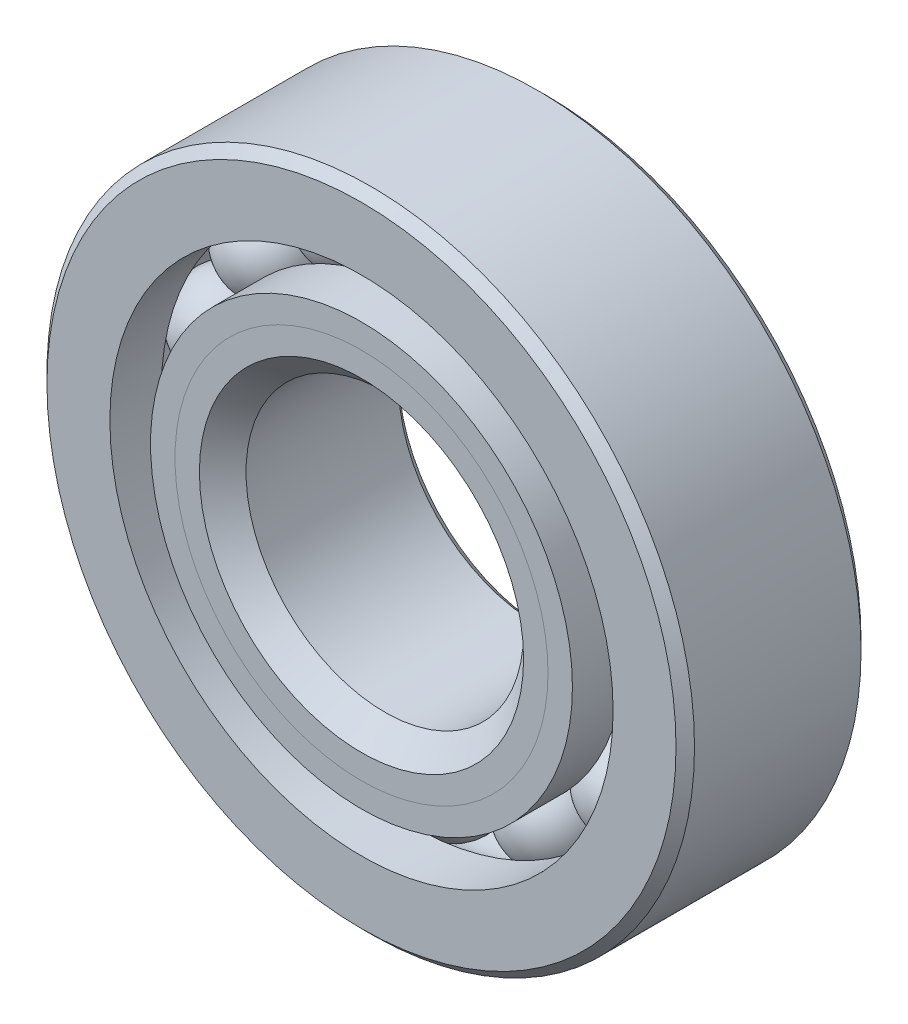
ISO-10303-21;
HEADER;
FILE_DESCRIPTION(('STEP AP214'),'2;1');
FILE_NAME('part.step','',(''),(''),'','','');
FILE_SCHEMA(('AUTOMOTIVE_DESIGN { 1 0 10303 214 1 1 1 1 }'));
ENDSEC;
DATA;
#1=APPLICATION_CONTEXT('core data for automotive mechanical design processes');
#2=APPLICATION_PROTOCOL_DEFINITION('international standard','automotive_design',2000,#1);
#3=PRODUCT_CONTEXT('',#1,'mechanical');
#4=PRODUCT('Part','Part','',(#3));
#5=PRODUCT_RELATED_PRODUCT_CATEGORY('part','',(#4));
#6=PRODUCT_DEFINITION_FORMATION('','',#4);
#7=PRODUCT_DEFINITION_CONTEXT('part definition',#1,'design');
#8=PRODUCT_DEFINITION('design','',#6,#7);
#9=PRODUCT_DEFINITION_SHAPE('','',#8);
#10=(LENGTH_UNIT() NAMED_UNIT(*) SI_UNIT(.MILLI.,.METRE.));
#11=(NAMED_UNIT(*) PLANE_ANGLE_UNIT() SI_UNIT($,.RADIAN.));
#12=(NAMED_UNIT(*) SI_UNIT($,.STERADIAN.) SOLID_ANGLE_UNIT());
#13=UNCERTAINTY_MEASURE_WITH_UNIT(LENGTH_MEASURE(1.E-05),#10,'distance_accuracy_value','');
#14=(GEOMETRIC_REPRESENTATION_CONTEXT(3) GLOBAL_UNCERTAINTY_ASSIGNED_CONTEXT((#13)) GLOBAL_UNIT_ASSIGNED_CONTEXT((#10,
#11,#12)) REPRESENTATION_CONTEXT('',''));
#15=CARTESIAN_POINT('',(0.,0.,0.));
#16=DIRECTION('',(0.,0.,1.));
#17=DIRECTION('',(1.,0.,0.));
#18=AXIS2_PLACEMENT_3D('',#15,#16,#17);
#19=CARTESIAN_POINT('',(-3.44395217924552,7.1514403889755,0.));
#20=DIRECTION('',(0.,0.,1.));
#21=DIRECTION('',(0.433883739117546,-0.900968867902425,0.));
#22=AXIS2_PLACEMENT_3D('',#19,#20,#21);
#23=SPHERICAL_SURFACE('',#22,1.57421805197336);
#24=CARTESIAN_POINT('',(-3.44395217924552,7.1514403889755,1.57421805197336));
#25=VERTEX_POINT('',#24);
#26=VERTEX_LOOP('',#25);
#27=FACE_BOUND('',#26,.T.);
#28=ADVANCED_FACE('F43',(#27),#23,.T.);
#29=CLOSED_SHELL('',(#28));
#30=MANIFOLD_SOLID_BREP('B2',#29);
#31=CARTESIAN_POINT('',(-6.20578739208992,4.94895030225377,0.));
#32=DIRECTION('',(0.,0.,1.));
#33=DIRECTION('',(0.781831482468022,-0.623489801858743,0.));
#34=AXIS2_PLACEMENT_3D('',#31,#32,#33);
#35=SPHERICAL_SURFACE('',#34,1.57421805197336);
#36=CARTESIAN_POINT('',(-6.20578739208992,4.94895030225377,1.57421805197336));
#37=VERTEX_POINT('',#36);
#38=VERTEX_LOOP('',#37);
#39=FACE_BOUND('',#38,.T.);
#40=ADVANCED_FACE('F64',(#39),#35,.T.);
#41=CLOSED_SHELL('',(#40));
#42=MANIFOLD_SOLID_BREP('B6',#41);
#43=CARTESIAN_POINT('',(-7.73849030294321,1.76625991327833,0.));
#44=DIRECTION('',(0.,0.,1.));
#45=DIRECTION('',(0.974927912181821,-0.222520933956325,0.));
#46=AXIS2_PLACEMENT_3D('',#43,#44,#45);
#47=SPHERICAL_SURFACE('',#46,1.57421805197336);
#48=CARTESIAN_POINT('',(-7.73849030294321,1.76625991327833,1.57421805197336));
#49=VERTEX_POINT('',#48);
#50=VERTEX_LOOP('',#49);
#51=FACE_BOUND('',#50,.T.);
#52=ADVANCED_FACE('F85',(#51),#47,.T.);
#53=CLOSED_SHELL('',(#52));
#54=MANIFOLD_SOLID_BREP('B39',#53);
#55=CARTESIAN_POINT('',(-7.73849030294324,-1.76625991327817,0.));
#56=DIRECTION('',(0.,0.,1.));
#57=DIRECTION('',(0.974927912181826,0.222520933956305,0.));
#58=AXIS2_PLACEMENT_3D('',#55,#56,#57);
#59=SPHERICAL_SURFACE('',#58,1.57421805197336);
#60=CARTESIAN_POINT('',(-7.73849030294324,-1.76625991327817,1.57421805197336));
#61=VERTEX_POINT('',#60);
#62=VERTEX_LOOP('',#61);
#63=FACE_BOUND('',#62,.T.);
#64=ADVANCED_FACE('F106',(#63),#59,.T.);
#65=CLOSED_SHELL('',(#64));
#66=MANIFOLD_SOLID_BREP('B60',#65);
#67=CARTESIAN_POINT('',(-6.20578739209003,-4.94895030225364,0.));
#68=DIRECTION('',(0.,0.,1.));
#69=DIRECTION('',(0.781831482468035,0.623489801858727,0.));
#70=AXIS2_PLACEMENT_3D('',#67,#68,#69);
#71=SPHERICAL_SURFACE('',#70,1.57421805197336);
#72=CARTESIAN_POINT('',(-6.20578739209003,-4.94895030225364,1.57421805197336));
#73=VERTEX_POINT('',#72);
#74=VERTEX_LOOP('',#73);
#75=FACE_BOUND('',#74,.T.);
#76=ADVANCED_FACE('F127',(#75),#71,.T.);
#77=CLOSED_SHELL('',(#76));
#78=MANIFOLD_SOLID_BREP('B81',#77);
#79=CARTESIAN_POINT('',(-3.44395217924567,-7.15144038897542,0.));
#80=DIRECTION('',(0.,0.,1.));
#81=DIRECTION('',(0.433883739117565,0.900968867902416,0.));
#82=AXIS2_PLACEMENT_3D('',#79,#80,#81);
#83=SPHERICAL_SURFACE('',#82,1.57421805197336);
#84=CARTESIAN_POINT('',(-3.44395217924567,-7.15144038897542,1.57421805197336));
#85=VERTEX_POINT('',#84);
#86=VERTEX_LOOP('',#85);
#87=FACE_BOUND('',#86,.T.);
#88=ADVANCED_FACE('F148',(#87),#83,.T.);
#89=CLOSED_SHELL('',(#88));
#90=MANIFOLD_SOLID_BREP('B102',#89);
#91=CARTESIAN_POINT('',(0.,-7.9375,0.));
#92=DIRECTION('',(0.,0.,1.));
#93=DIRECTION('',(0.,1.,0.));
#94=AXIS2_PLACEMENT_3D('',#91,#92,#93);
#95=SPHERICAL_SURFACE('',#94,1.57421805197336);
#96=CARTESIAN_POINT('',(0.,-7.9375,1.57421805197336));
#97=VERTEX_POINT('',#96);
#98=VERTEX_LOOP('',#97);
#99=FACE_BOUND('',#98,.T.);
#100=ADVANCED_FACE('F169',(#99),#95,.T.);
#101=CLOSED_SHELL('',(#100));
#102=MANIFOLD_SOLID_BREP('B123',#101);
#103=CARTESIAN_POINT('',(3.44395217924557,-7.15144038897547,0.));
#104=DIRECTION('',(0.,0.,1.));
#105=DIRECTION('',(-0.433883739117553,0.900968867902422,0.));
#106=AXIS2_PLACEMENT_3D('',#103,#104,#105);
#107=SPHERICAL_SURFACE('',#106,1.57421805197336);
#108=CARTESIAN_POINT('',(3.44395217924557,-7.15144038897547,1.57421805197336));
#109=VERTEX_POINT('',#108);
#110=VERTEX_LOOP('',#109);
#111=FACE_BOUND('',#110,.T.);
#112=ADVANCED_FACE('F190',(#111),#107,.T.);
#113=CLOSED_SHELL('',(#112));
#114=MANIFOLD_SOLID_BREP('B144',#113);
#115=CARTESIAN_POINT('',(6.20578739208996,-4.94895030225373,0.));
#116=DIRECTION('',(0.,0.,1.));
#117=DIRECTION('',(-0.781831482468027,0.623489801858737,0.));
#118=AXIS2_PLACEMENT_3D('',#115,#116,#117);
#119=SPHERICAL_SURFACE('',#118,1.57421805197336);
#120=CARTESIAN_POINT('',(6.20578739208996,-4.94895030225373,1.57421805197336));
#121=VERTEX_POINT('',#120);
#122=VERTEX_LOOP('',#121);
#123=FACE_BOUND('',#122,.T.);
#124=ADVANCED_FACE('F211',(#123),#119,.T.);
#125=CLOSED_SHELL('',(#124));
#126=MANIFOLD_SOLID_BREP('B165',#125);
#127=CARTESIAN_POINT('',(7.73849030294322,-1.76625991327828,0.));
#128=DIRECTION('',(0.,0.,1.));
#129=DIRECTION('',(-0.974927912181823,0.222520933956318,0.));
#130=AXIS2_PLACEMENT_3D('',#127,#128,#129);
#131=SPHERICAL_SURFACE('',#130,1.57421805197336);
#132=CARTESIAN_POINT('',(7.73849030294322,-1.76625991327828,1.57421805197336));
#133=VERTEX_POINT('',#132);
#134=VERTEX_LOOP('',#133);
#135=FACE_BOUND('',#134,.T.);
#136=ADVANCED_FACE('F232',(#135),#131,.T.);
#137=CLOSED_SHELL('',(#136));
#138=MANIFOLD_SOLID_BREP('B186',#137);
#139=CARTESIAN_POINT('',(7.73849030294323,1.76625991327822,0.));
#140=DIRECTION('',(0.,0.,1.));
#141=DIRECTION('',(-0.974927912181824,-0.222520933956311,0.));
#142=AXIS2_PLACEMENT_3D('',#139,#140,#141);
#143=SPHERICAL_SURFACE('',#142,1.57421805197336);
#144=CARTESIAN_POINT('',(7.73849030294323,1.76625991327822,1.57421805197336));
#145=VERTEX_POINT('',#144);
#146=VERTEX_LOOP('',#145);
#147=FACE_BOUND('',#146,.T.);
#148=ADVANCED_FACE('F253',(#147),#143,.T.);
#149=CLOSED_SHELL('',(#148));
#150=MANIFOLD_SOLID_BREP('B207',#149);
#151=CARTESIAN_POINT('',(6.20578739209,4.94895030225368,0.));
#152=DIRECTION('',(0.,0.,1.));
#153=DIRECTION('',(-0.781831482468031,-0.623489801858732,0.));
#154=AXIS2_PLACEMENT_3D('',#151,#152,#153);
#155=SPHERICAL_SURFACE('',#154,1.57421805197336);
#156=CARTESIAN_POINT('',(6.20578739209,4.94895030225368,1.57421805197336));
#157=VERTEX_POINT('',#156);
#158=VERTEX_LOOP('',#157);
#159=FACE_BOUND('',#158,.T.);
#160=ADVANCED_FACE('F274',(#159),#155,.T.);
#161=CLOSED_SHELL('',(#160));
#162=MANIFOLD_SOLID_BREP('B228',#161);
#163=CARTESIAN_POINT('',(3.44395217924562,7.15144038897545,0.));
#164=DIRECTION('',(0.,0.,1.));
#165=DIRECTION('',(-0.433883739117559,-0.900968867902419,0.));
#166=AXIS2_PLACEMENT_3D('',#163,#164,#165);
#167=SPHERICAL_SURFACE('',#166,1.57421805197336);
#168=CARTESIAN_POINT('',(3.44395217924562,7.15144038897545,1.57421805197336));
#169=VERTEX_POINT('',#168);
#170=VERTEX_LOOP('',#169);
#171=FACE_BOUND('',#170,.T.);
#172=ADVANCED_FACE('F295',(#171),#167,.T.);
#173=CLOSED_SHELL('',(#172));
#174=MANIFOLD_SOLID_BREP('B249',#173);
#175=CARTESIAN_POINT('',(0.,7.9375,0.));
#176=DIRECTION('',(0.,0.,1.));
#177=DIRECTION('',(0.,-1.,0.));
#178=AXIS2_PLACEMENT_3D('',#175,#176,#177);
#179=SPHERICAL_SURFACE('',#178,1.57421805197336);
#180=CARTESIAN_POINT('',(0.,7.9375,1.57421805197336));
#181=VERTEX_POINT('',#180);
#182=VERTEX_LOOP('',#181);
#183=FACE_BOUND('',#182,.T.);
#184=ADVANCED_FACE('F317',(#183),#179,.T.);
#185=CLOSED_SHELL('',(#184));
#186=MANIFOLD_SOLID_BREP('B270',#185);
#187=CARTESIAN_POINT('',(0.,6.40129438810556,3.175));
#188=DIRECTION('',(0.,0.,-1.));
#189=DIRECTION('',(-1.,0.,0.));
#190=AXIS2_PLACEMENT_3D('',#187,#188,#189);
#191=PLANE('',#190);
#192=CARTESIAN_POINT('',(0.,0.,3.175));
#193=DIRECTION('',(0.,0.,1.));
#194=DIRECTION('',(1.,0.,0.));
#195=AXIS2_PLACEMENT_3D('',#192,#193,#194);
#196=CIRCLE('',#195,5.56289097401332);
#197=CARTESIAN_POINT('',(5.56289097401332,0.,3.175));
#198=VERTEX_POINT('',#197);
#199=EDGE_CURVE('E372',#198,#198,#196,.T.);
#200=ORIENTED_EDGE('',*,*,#199,.F.);
#201=EDGE_LOOP('',(#200));
#202=FACE_BOUND('',#201,.T.);
#203=CARTESIAN_POINT('',(0.,0.,3.175));
#204=DIRECTION('',(0.,0.,1.));
#205=DIRECTION('',(1.,0.,0.));
#206=AXIS2_PLACEMENT_3D('',#203,#204,#205);
#207=CIRCLE('',#206,6.40129438810556);
#208=CARTESIAN_POINT('',(6.40129438810556,0.,3.175));
#209=VERTEX_POINT('',#208);
#210=EDGE_CURVE('E316',#209,#209,#207,.T.);
#211=ORIENTED_EDGE('',*,*,#210,.T.);
#212=EDGE_LOOP('',(#211));
#213=FACE_BOUND('',#212,.T.);
#214=ADVANCED_FACE('F338',(#202,#213),#191,.F.);
#215=CARTESIAN_POINT('',(0.,0.,2.33659658590776));
#216=DIRECTION('',(0.,0.,1.));
#217=DIRECTION('',(1.,0.,0.));
#218=AXIS2_PLACEMENT_3D('',#215,#216,#217);
#219=CONICAL_SURFACE('',#218,5.56289097401332,0.785398163397449);
#220=ORIENTED_EDGE('',*,*,#210,.F.);
#221=EDGE_LOOP('',(#220));
#222=FACE_BOUND('',#221,.T.);
#223=CARTESIAN_POINT('',(0.,0.,2.33659658590776));
#224=DIRECTION('',(0.,0.,1.));
#225=DIRECTION('',(1.,0.,0.));
#226=AXIS2_PLACEMENT_3D('',#223,#224,#225);
#227=CIRCLE('',#226,5.56289097401332);
#228=CARTESIAN_POINT('',(5.56289097401332,0.,2.33659658590776));
#229=VERTEX_POINT('',#228);
#230=EDGE_CURVE('E344',#229,#229,#227,.T.);
#231=ORIENTED_EDGE('',*,*,#230,.T.);
#232=EDGE_LOOP('',(#231));
#233=FACE_BOUND('',#232,.T.);
#234=ADVANCED_FACE('F379',(#222,#233),#219,.T.);
#235=CARTESIAN_POINT('',(0.,0.,3.175));
#236=DIRECTION('',(0.,0.,1.));
#237=DIRECTION('',(1.,0.,0.));
#238=AXIS2_PLACEMENT_3D('',#235,#236,#237);
#239=CYLINDRICAL_SURFACE('',#238,5.56289097401332);
#240=ORIENTED_EDGE('',*,*,#230,.F.);
#241=EDGE_LOOP('',(#240));
#242=FACE_BOUND('',#241,.T.);
#243=CARTESIAN_POINT('',(0.,0.,0.));
#244=DIRECTION('',(0.,0.,1.));
#245=DIRECTION('',(1.,0.,0.));
#246=AXIS2_PLACEMENT_3D('',#243,#244,#245);
#247=CIRCLE('',#246,5.56289097401332);
#248=CARTESIAN_POINT('',(5.56289097401332,0.,0.));
#249=VERTEX_POINT('',#248);
#250=EDGE_CURVE('E348',#249,#249,#247,.T.);
#251=ORIENTED_EDGE('',*,*,#250,.T.);
#252=EDGE_LOOP('',(#251));
#253=FACE_BOUND('',#252,.T.);
#254=ADVANCED_FACE('F383',(#242,#253),#239,.T.);
#255=CARTESIAN_POINT('',(0.,5.56289097401332,0.));
#256=DIRECTION('',(0.,0.,-1.));
#257=DIRECTION('',(-1.,0.,0.));
#258=AXIS2_PLACEMENT_3D('',#255,#256,#257);
#259=PLANE('',#258);
#260=ORIENTED_EDGE('',*,*,#250,.F.);
#261=EDGE_LOOP('',(#260));
#262=FACE_BOUND('',#261,.T.);
#263=CARTESIAN_POINT('',(0.,0.,0.));
#264=DIRECTION('',(0.,0.,1.));
#265=DIRECTION('',(1.,0.,0.));
#266=AXIS2_PLACEMENT_3D('',#263,#264,#265);
#267=CIRCLE('',#266,6.36328194802663);
#268=CARTESIAN_POINT('',(6.36328194802663,0.,0.));
#269=VERTEX_POINT('',#268);
#270=EDGE_CURVE('E352',#269,#269,#267,.T.);
#271=ORIENTED_EDGE('',*,*,#270,.T.);
#272=EDGE_LOOP('',(#271));
#273=FACE_BOUND('',#272,.T.);
#274=ADVANCED_FACE('F388',(#262,#273),#259,.F.);
#275=CARTESIAN_POINT('',(0.,0.,0.));
#276=DIRECTION('',(0.,0.,1.));
#277=DIRECTION('',(1.,0.,0.));
#278=AXIS2_PLACEMENT_3D('',#275,#276,#277);
#279=TOROIDAL_SURFACE('',#278,7.9375,1.57421805197336);
#280=ORIENTED_EDGE('',*,*,#270,.F.);
#281=EDGE_LOOP('',(#280));
#282=FACE_BOUND('',#281,.T.);
#283=CARTESIAN_POINT('',(0.,0.,-1.41111111111111));
#284=DIRECTION('',(0.,0.,1.));
#285=DIRECTION('',(1.,0.,0.));
#286=AXIS2_PLACEMENT_3D('',#283,#284,#285);
#287=CIRCLE('',#286,7.2396978021978);
#288=CARTESIAN_POINT('',(7.2396978021978,0.,-1.41111111111111));
#289=VERTEX_POINT('',#288);
#290=EDGE_CURVE('E357',#289,#289,#287,.T.);
#291=ORIENTED_EDGE('',*,*,#290,.T.);
#292=EDGE_LOOP('',(#291));
#293=FACE_BOUND('',#292,.T.);
#294=ADVANCED_FACE('F394',(#282,#293),#279,.F.);
#295=CARTESIAN_POINT('',(0.,0.,3.175));
#296=DIRECTION('',(0.,0.,1.));
#297=DIRECTION('',(1.,0.,0.));
#298=AXIS2_PLACEMENT_3D('',#295,#296,#297);
#299=CYLINDRICAL_SURFACE('',#298,7.2396978021978);
#300=ORIENTED_EDGE('',*,*,#290,.F.);
#301=EDGE_LOOP('',(#300));
#302=FACE_BOUND('',#301,.T.);
#303=CARTESIAN_POINT('',(0.,0.,-3.175));
#304=DIRECTION('',(0.,0.,1.));
#305=DIRECTION('',(1.,0.,0.));
#306=AXIS2_PLACEMENT_3D('',#303,#304,#305);
#307=CIRCLE('',#306,7.2396978021978);
#308=CARTESIAN_POINT('',(7.2396978021978,0.,-3.175));
#309=VERTEX_POINT('',#308);
#310=EDGE_CURVE('E360',#309,#309,#307,.T.);
#311=ORIENTED_EDGE('',*,*,#310,.T.);
#312=EDGE_LOOP('',(#311));
#313=FACE_BOUND('',#312,.T.);
#314=ADVANCED_FACE('F398',(#302,#313),#299,.T.);
#315=CARTESIAN_POINT('',(0.,5.08,-3.175));
#316=DIRECTION('',(0.,0.,1.));
#317=DIRECTION('',(1.,0.,0.));
#318=AXIS2_PLACEMENT_3D('',#315,#316,#317);
#319=PLANE('',#318);
#320=ORIENTED_EDGE('',*,*,#310,.F.);
#321=EDGE_LOOP('',(#320));
#322=FACE_BOUND('',#321,.T.);
#323=CARTESIAN_POINT('',(0.,0.,-3.175));
#324=DIRECTION('',(0.,0.,1.));
#325=DIRECTION('',(1.,0.,0.));
#326=AXIS2_PLACEMENT_3D('',#323,#324,#325);
#327=CIRCLE('',#326,5.08);
#328=CARTESIAN_POINT('',(5.08,0.,-3.175));
#329=VERTEX_POINT('',#328);
#330=EDGE_CURVE('E363',#329,#329,#327,.T.);
#331=ORIENTED_EDGE('',*,*,#330,.T.);
#332=EDGE_LOOP('',(#331));
#333=FACE_BOUND('',#332,.T.);
#334=ADVANCED_FACE('F402',(#322,#333),#319,.F.);
#335=CARTESIAN_POINT('',(0.,0.,-2.8575));
#336=DIRECTION('',(0.,0.,-1.));
#337=DIRECTION('',(-1.,0.,0.));
#338=AXIS2_PLACEMENT_3D('',#335,#336,#337);
#339=CONICAL_SURFACE('',#338,4.7625,0.78539816339745);
#340=ORIENTED_EDGE('',*,*,#330,.F.);
#341=EDGE_LOOP('',(#340));
#342=FACE_BOUND('',#341,.T.);
#343=CARTESIAN_POINT('',(0.,0.,-2.8575));
#344=DIRECTION('',(0.,0.,1.));
#345=DIRECTION('',(1.,0.,0.));
#346=AXIS2_PLACEMENT_3D('',#343,#344,#345);
#347=CIRCLE('',#346,4.7625);
#348=CARTESIAN_POINT('',(4.7625,0.,-2.8575));
#349=VERTEX_POINT('',#348);
#350=EDGE_CURVE('E366',#349,#349,#347,.T.);
#351=ORIENTED_EDGE('',*,*,#350,.T.);
#352=EDGE_LOOP('',(#351));
#353=FACE_BOUND('',#352,.T.);
#354=ADVANCED_FACE('F406',(#342,#353),#339,.F.);
#355=CARTESIAN_POINT('',(0.,0.,3.175));
#356=DIRECTION('',(0.,0.,1.));
#357=DIRECTION('',(1.,0.,0.));
#358=AXIS2_PLACEMENT_3D('',#355,#356,#357);
#359=CYLINDRICAL_SURFACE('',#358,4.7625);
#360=ORIENTED_EDGE('',*,*,#350,.F.);
#361=EDGE_LOOP('',(#360));
#362=FACE_BOUND('',#361,.T.);
#363=CARTESIAN_POINT('',(0.,0.,2.37460902598669));
#364=DIRECTION('',(0.,0.,1.));
#365=DIRECTION('',(1.,0.,0.));
#366=AXIS2_PLACEMENT_3D('',#363,#364,#365);
#367=CIRCLE('',#366,4.7625);
#368=CARTESIAN_POINT('',(4.7625,0.,2.37460902598669));
#369=VERTEX_POINT('',#368);
#370=EDGE_CURVE('E369',#369,#369,#367,.T.);
#371=ORIENTED_EDGE('',*,*,#370,.T.);
#372=EDGE_LOOP('',(#371));
#373=FACE_BOUND('',#372,.T.);
#374=ADVANCED_FACE('F410',(#362,#373),#359,.F.);
#375=CARTESIAN_POINT('',(0.,0.,3.175));
#376=DIRECTION('',(0.,0.,1.));
#377=DIRECTION('',(1.,0.,0.));
#378=AXIS2_PLACEMENT_3D('',#375,#376,#377);
#379=CONICAL_SURFACE('',#378,5.56289097401332,0.78539816339745);
#380=ORIENTED_EDGE('',*,*,#370,.F.);
#381=EDGE_LOOP('',(#380));
#382=FACE_BOUND('',#381,.T.);
#383=ORIENTED_EDGE('',*,*,#199,.T.);
#384=EDGE_LOOP('',(#383));
#385=FACE_BOUND('',#384,.T.);
#386=ADVANCED_FACE('F376',(#382,#385),#379,.F.);
#387=CLOSED_SHELL('',(#214,#234,#254,#274,#294,#314,#334,#354,#374,#386));
#388=MANIFOLD_SOLID_BREP('B291',#387);
#389=CARTESIAN_POINT('',(0.,7.2396978021978,3.175));
#390=DIRECTION('',(0.,0.,-1.));
#391=DIRECTION('',(-1.,0.,0.));
#392=AXIS2_PLACEMENT_3D('',#389,#390,#391);
#393=PLANE('',#392);
#394=CARTESIAN_POINT('',(0.,0.,3.175));
#395=DIRECTION('',(0.,0.,1.));
#396=DIRECTION('',(1.,0.,0.));
#397=AXIS2_PLACEMENT_3D('',#394,#395,#396);
#398=CIRCLE('',#397,6.40129438810556);
#399=CARTESIAN_POINT('',(6.40129438810556,0.,3.175));
#400=VERTEX_POINT('',#399);
#401=EDGE_CURVE('E337',#400,#400,#398,.T.);
#402=ORIENTED_EDGE('',*,*,#401,.F.);
#403=EDGE_LOOP('',(#402));
#404=FACE_BOUND('',#403,.T.);
#405=CARTESIAN_POINT('',(0.,0.,3.175));
#406=DIRECTION('',(0.,0.,1.));
#407=DIRECTION('',(1.,0.,0.));
#408=AXIS2_PLACEMENT_3D('',#405,#406,#407);
#409=CIRCLE('',#408,7.2396978021978);
#410=CARTESIAN_POINT('',(7.2396978021978,0.,3.175));
#411=VERTEX_POINT('',#410);
#412=EDGE_CURVE('E519',#411,#411,#409,.T.);
#413=ORIENTED_EDGE('',*,*,#412,.T.);
#414=EDGE_LOOP('',(#413));
#415=FACE_BOUND('',#414,.T.);
#416=ADVANCED_FACE('F497',(#404,#415),#393,.F.);
#417=CARTESIAN_POINT('',(0.,0.,3.175));
#418=DIRECTION('',(0.,0.,1.));
#419=DIRECTION('',(1.,0.,0.));
#420=AXIS2_PLACEMENT_3D('',#417,#418,#419);
#421=CONICAL_SURFACE('',#420,6.40129438810556,0.785398163397449);
#422=CARTESIAN_POINT('',(0.,0.,2.33659658590776));
#423=DIRECTION('',(0.,0.,1.));
#424=DIRECTION('',(1.,0.,0.));
#425=AXIS2_PLACEMENT_3D('',#422,#423,#424);
#426=CIRCLE('',#425,5.56289097401332);
#427=CARTESIAN_POINT('',(5.56289097401332,0.,2.33659658590776));
#428=VERTEX_POINT('',#427);
#429=EDGE_CURVE('E503',#428,#428,#426,.T.);
#430=ORIENTED_EDGE('',*,*,#429,.F.);
#431=EDGE_LOOP('',(#430));
#432=FACE_BOUND('',#431,.T.);
#433=ORIENTED_EDGE('',*,*,#401,.T.);
#434=EDGE_LOOP('',(#433));
#435=FACE_BOUND('',#434,.T.);
#436=ADVANCED_FACE('F544',(#432,#435),#421,.F.);
#437=CARTESIAN_POINT('',(0.,0.,3.175));
#438=DIRECTION('',(0.,0.,1.));
#439=DIRECTION('',(1.,0.,0.));
#440=AXIS2_PLACEMENT_3D('',#437,#438,#439);
#441=CYLINDRICAL_SURFACE('',#440,5.56289097401332);
#442=CARTESIAN_POINT('',(0.,0.,0.));
#443=DIRECTION('',(0.,0.,1.));
#444=DIRECTION('',(1.,0.,0.));
#445=AXIS2_PLACEMENT_3D('',#442,#443,#444);
#446=CIRCLE('',#445,5.56289097401332);
#447=CARTESIAN_POINT('',(5.56289097401332,0.,0.));
#448=VERTEX_POINT('',#447);
#449=EDGE_CURVE('E507',#448,#448,#446,.T.);
#450=ORIENTED_EDGE('',*,*,#449,.F.);
#451=EDGE_LOOP('',(#450));
#452=FACE_BOUND('',#451,.T.);
#453=ORIENTED_EDGE('',*,*,#429,.T.);
#454=EDGE_LOOP('',(#453));
#455=FACE_BOUND('',#454,.T.);
#456=ADVANCED_FACE('F539',(#452,#455),#441,.F.);
#457=CARTESIAN_POINT('',(0.,5.56289097401332,0.));
#458=DIRECTION('',(0.,0.,1.));
#459=DIRECTION('',(1.,0.,0.));
#460=AXIS2_PLACEMENT_3D('',#457,#458,#459);
#461=PLANE('',#460);
#462=CARTESIAN_POINT('',(0.,0.,0.));
#463=DIRECTION('',(0.,0.,1.));
#464=DIRECTION('',(1.,0.,0.));
#465=AXIS2_PLACEMENT_3D('',#462,#463,#464);
#466=CIRCLE('',#465,6.36328194802663);
#467=CARTESIAN_POINT('',(6.36328194802663,0.,0.));
#468=VERTEX_POINT('',#467);
#469=EDGE_CURVE('E511',#468,#468,#466,.T.);
#470=ORIENTED_EDGE('',*,*,#469,.F.);
#471=EDGE_LOOP('',(#470));
#472=FACE_BOUND('',#471,.T.);
#473=ORIENTED_EDGE('',*,*,#449,.T.);
#474=EDGE_LOOP('',(#473));
#475=FACE_BOUND('',#474,.T.);
#476=ADVANCED_FACE('F533',(#472,#475),#461,.F.);
#477=CARTESIAN_POINT('',(0.,0.,0.));
#478=DIRECTION('',(0.,0.,1.));
#479=DIRECTION('',(1.,0.,0.));
#480=AXIS2_PLACEMENT_3D('',#477,#478,#479);
#481=TOROIDAL_SURFACE('',#480,7.9375,1.57421805197336);
#482=CARTESIAN_POINT('',(0.,0.,1.41111111111111));
#483=DIRECTION('',(0.,0.,1.));
#484=DIRECTION('',(1.,0.,0.));
#485=AXIS2_PLACEMENT_3D('',#482,#483,#484);
#486=CIRCLE('',#485,7.2396978021978);
#487=CARTESIAN_POINT('',(7.2396978021978,0.,1.41111111111111));
#488=VERTEX_POINT('',#487);
#489=EDGE_CURVE('E516',#488,#488,#486,.T.);
#490=ORIENTED_EDGE('',*,*,#489,.F.);
#491=EDGE_LOOP('',(#490));
#492=FACE_BOUND('',#491,.T.);
#493=ORIENTED_EDGE('',*,*,#469,.T.);
#494=EDGE_LOOP('',(#493));
#495=FACE_BOUND('',#494,.T.);
#496=ADVANCED_FACE('F527',(#492,#495),#481,.F.);
#497=CARTESIAN_POINT('',(0.,0.,3.175));
#498=DIRECTION('',(0.,0.,1.));
#499=DIRECTION('',(1.,0.,0.));
#500=AXIS2_PLACEMENT_3D('',#497,#498,#499);
#501=CYLINDRICAL_SURFACE('',#500,7.2396978021978);
#502=ORIENTED_EDGE('',*,*,#412,.F.);
#503=EDGE_LOOP('',(#502));
#504=FACE_BOUND('',#503,.T.);
#505=ORIENTED_EDGE('',*,*,#489,.T.);
#506=EDGE_LOOP('',(#505));
#507=FACE_BOUND('',#506,.T.);
#508=ADVANCED_FACE('F524',(#504,#507),#501,.T.);
#509=CLOSED_SHELL('',(#416,#436,#456,#476,#496,#508));
#510=MANIFOLD_SOLID_BREP('B311',#509);
#511=CARTESIAN_POINT('',(0.,0.,2.8575));
#512=DIRECTION('',(0.,0.,-1.));
#513=DIRECTION('',(-1.,0.,0.));
#514=AXIS2_PLACEMENT_3D('',#511,#512,#513);
#515=CONICAL_SURFACE('',#514,11.1125,0.785398163397448);
#516=CARTESIAN_POINT('',(0.,0.,3.175));
#517=DIRECTION('',(0.,0.,1.));
#518=DIRECTION('',(1.,0.,0.));
#519=AXIS2_PLACEMENT_3D('',#516,#517,#518);
#520=CIRCLE('',#519,10.795);
#521=CARTESIAN_POINT('',(10.795,0.,3.175));
#522=VERTEX_POINT('',#521);
#523=EDGE_CURVE('E617',#522,#522,#520,.T.);
#524=ORIENTED_EDGE('',*,*,#523,.F.);
#525=EDGE_LOOP('',(#524));
#526=FACE_BOUND('',#525,.T.);
#527=CARTESIAN_POINT('',(0.,0.,2.8575));
#528=DIRECTION('',(0.,0.,1.));
#529=DIRECTION('',(1.,0.,0.));
#530=AXIS2_PLACEMENT_3D('',#527,#528,#529);
#531=CIRCLE('',#530,11.1125);
#532=CARTESIAN_POINT('',(11.1125,0.,2.8575));
#533=VERTEX_POINT('',#532);
#534=EDGE_CURVE('E496',#533,#533,#531,.T.);
#535=ORIENTED_EDGE('',*,*,#534,.T.);
#536=EDGE_LOOP('',(#535));
#537=FACE_BOUND('',#536,.T.);
#538=ADVANCED_FACE('F589',(#526,#537),#515,.T.);
#539=CARTESIAN_POINT('',(0.,0.,3.175));
#540=DIRECTION('',(0.,0.,1.));
#541=DIRECTION('',(1.,0.,0.));
#542=AXIS2_PLACEMENT_3D('',#539,#540,#541);
#543=CYLINDRICAL_SURFACE('',#542,11.1125);
#544=ORIENTED_EDGE('',*,*,#534,.F.);
#545=EDGE_LOOP('',(#544));
#546=FACE_BOUND('',#545,.T.);
#547=CARTESIAN_POINT('',(0.,0.,-2.8575));
#548=DIRECTION('',(0.,0.,1.));
#549=DIRECTION('',(1.,0.,0.));
#550=AXIS2_PLACEMENT_3D('',#547,#548,#549);
#551=CIRCLE('',#550,11.1125);
#552=CARTESIAN_POINT('',(11.1125,0.,-2.8575));
#553=VERTEX_POINT('',#552);
#554=EDGE_CURVE('E595',#553,#553,#551,.T.);
#555=ORIENTED_EDGE('',*,*,#554,.T.);
#556=EDGE_LOOP('',(#555));
#557=FACE_BOUND('',#556,.T.);
#558=ADVANCED_FACE('F624',(#546,#557),#543,.T.);
#559=CARTESIAN_POINT('',(0.,0.,-3.175));
#560=DIRECTION('',(0.,0.,1.));
#561=DIRECTION('',(1.,0.,0.));
#562=AXIS2_PLACEMENT_3D('',#559,#560,#561);
#563=CONICAL_SURFACE('',#562,10.795,0.785398163397448);
#564=ORIENTED_EDGE('',*,*,#554,.F.);
#565=EDGE_LOOP('',(#564));
#566=FACE_BOUND('',#565,.T.);
#567=CARTESIAN_POINT('',(0.,0.,-3.175));
#568=DIRECTION('',(0.,0.,1.));
#569=DIRECTION('',(1.,0.,0.));
#570=AXIS2_PLACEMENT_3D('',#567,#568,#569);
#571=CIRCLE('',#570,10.795);
#572=CARTESIAN_POINT('',(10.795,0.,-3.175));
#573=VERTEX_POINT('',#572);
#574=EDGE_CURVE('E599',#573,#573,#571,.T.);
#575=ORIENTED_EDGE('',*,*,#574,.T.);
#576=EDGE_LOOP('',(#575));
#577=FACE_BOUND('',#576,.T.);
#578=ADVANCED_FACE('F628',(#566,#577),#563,.T.);
#579=CARTESIAN_POINT('',(0.,10.795,-3.175));
#580=DIRECTION('',(0.,0.,1.));
#581=DIRECTION('',(1.,0.,0.));
#582=AXIS2_PLACEMENT_3D('',#579,#580,#581);
#583=PLANE('',#582);
#584=ORIENTED_EDGE('',*,*,#574,.F.);
#585=EDGE_LOOP('',(#584));
#586=FACE_BOUND('',#585,.T.);
#587=CARTESIAN_POINT('',(0.,0.,-3.17500000000001));
#588=DIRECTION('',(0.,0.,1.));
#589=DIRECTION('',(1.,0.,0.));
#590=AXIS2_PLACEMENT_3D('',#587,#588,#589);
#591=CIRCLE('',#590,8.63530219780219);
#592=CARTESIAN_POINT('',(8.63530219780219,0.,-3.17500000000001));
#593=VERTEX_POINT('',#592);
#594=EDGE_CURVE('E603',#593,#593,#591,.T.);
#595=ORIENTED_EDGE('',*,*,#594,.T.);
#596=EDGE_LOOP('',(#595));
#597=FACE_BOUND('',#596,.T.);
#598=ADVANCED_FACE('F633',(#586,#597),#583,.F.);
#599=CARTESIAN_POINT('',(0.,0.,3.175));
#600=DIRECTION('',(0.,0.,1.));
#601=DIRECTION('',(1.,0.,0.));
#602=AXIS2_PLACEMENT_3D('',#599,#600,#601);
#603=CYLINDRICAL_SURFACE('',#602,8.63530219780219);
#604=ORIENTED_EDGE('',*,*,#594,.F.);
#605=EDGE_LOOP('',(#604));
#606=FACE_BOUND('',#605,.T.);
#607=CARTESIAN_POINT('',(0.,0.,-1.41111111111111));
#608=DIRECTION('',(0.,0.,1.));
#609=DIRECTION('',(1.,0.,0.));
#610=AXIS2_PLACEMENT_3D('',#607,#608,#609);
#611=CIRCLE('',#610,8.6353021978022);
#612=CARTESIAN_POINT('',(8.6353021978022,0.,-1.41111111111111));
#613=VERTEX_POINT('',#612);
#614=EDGE_CURVE('E608',#613,#613,#611,.T.);
#615=ORIENTED_EDGE('',*,*,#614,.T.);
#616=EDGE_LOOP('',(#615));
#617=FACE_BOUND('',#616,.T.);
#618=ADVANCED_FACE('F639',(#606,#617),#603,.F.);
#619=CARTESIAN_POINT('',(0.,0.,0.));
#620=DIRECTION('',(0.,0.,1.));
#621=DIRECTION('',(1.,0.,0.));
#622=AXIS2_PLACEMENT_3D('',#619,#620,#621);
#623=TOROIDAL_SURFACE('',#622,7.9375,1.57421805197336);
#624=ORIENTED_EDGE('',*,*,#614,.F.);
#625=EDGE_LOOP('',(#624));
#626=FACE_BOUND('',#625,.T.);
#627=CARTESIAN_POINT('',(0.,0.,1.41111111111111));
#628=DIRECTION('',(0.,0.,1.));
#629=DIRECTION('',(1.,0.,0.));
#630=AXIS2_PLACEMENT_3D('',#627,#628,#629);
#631=CIRCLE('',#630,8.6353021978022);
#632=CARTESIAN_POINT('',(8.6353021978022,0.,1.41111111111111));
#633=VERTEX_POINT('',#632);
#634=EDGE_CURVE('E611',#633,#633,#631,.T.);
#635=ORIENTED_EDGE('',*,*,#634,.T.);
#636=EDGE_LOOP('',(#635));
#637=FACE_BOUND('',#636,.T.);
#638=ADVANCED_FACE('F643',(#626,#637),#623,.F.);
#639=CARTESIAN_POINT('',(0.,0.,3.175));
#640=DIRECTION('',(0.,0.,1.));
#641=DIRECTION('',(1.,0.,0.));
#642=AXIS2_PLACEMENT_3D('',#639,#640,#641);
#643=CYLINDRICAL_SURFACE('',#642,8.63530219780219);
#644=ORIENTED_EDGE('',*,*,#634,.F.);
#645=EDGE_LOOP('',(#644));
#646=FACE_BOUND('',#645,.T.);
#647=CARTESIAN_POINT('',(0.,0.,3.175));
#648=DIRECTION('',(0.,0.,1.));
#649=DIRECTION('',(1.,0.,0.));
#650=AXIS2_PLACEMENT_3D('',#647,#648,#649);
#651=CIRCLE('',#650,8.63530219780219);
#652=CARTESIAN_POINT('',(8.63530219780219,0.,3.175));
#653=VERTEX_POINT('',#652);
#654=EDGE_CURVE('E614',#653,#653,#651,.T.);
#655=ORIENTED_EDGE('',*,*,#654,.T.);
#656=EDGE_LOOP('',(#655));
#657=FACE_BOUND('',#656,.T.);
#658=ADVANCED_FACE('F647',(#646,#657),#643,.F.);
#659=CARTESIAN_POINT('',(0.,10.795,3.175));
#660=DIRECTION('',(0.,0.,-1.));
#661=DIRECTION('',(-1.,0.,0.));
#662=AXIS2_PLACEMENT_3D('',#659,#660,#661);
#663=PLANE('',#662);
#664=ORIENTED_EDGE('',*,*,#654,.F.);
#665=EDGE_LOOP('',(#664));
#666=FACE_BOUND('',#665,.T.);
#667=ORIENTED_EDGE('',*,*,#523,.T.);
#668=EDGE_LOOP('',(#667));
#669=FACE_BOUND('',#668,.T.);
#670=ADVANCED_FACE('F621',(#666,#669),#663,.F.);
#671=CLOSED_SHELL('',(#538,#558,#578,#598,#618,#638,#658,#670));
#672=MANIFOLD_SOLID_BREP('B332',#671);
#673=ADVANCED_BREP_SHAPE_REPRESENTATION('',(#18,#30,#42,#54,#66,#78,#90,#102,#114,#126,#138,
#150,#162,#174,#186,#388,#510,#672),#14);
#674=SHAPE_DEFINITION_REPRESENTATION(#9,#673);
ENDSEC;
END-ISO-10303-21;
